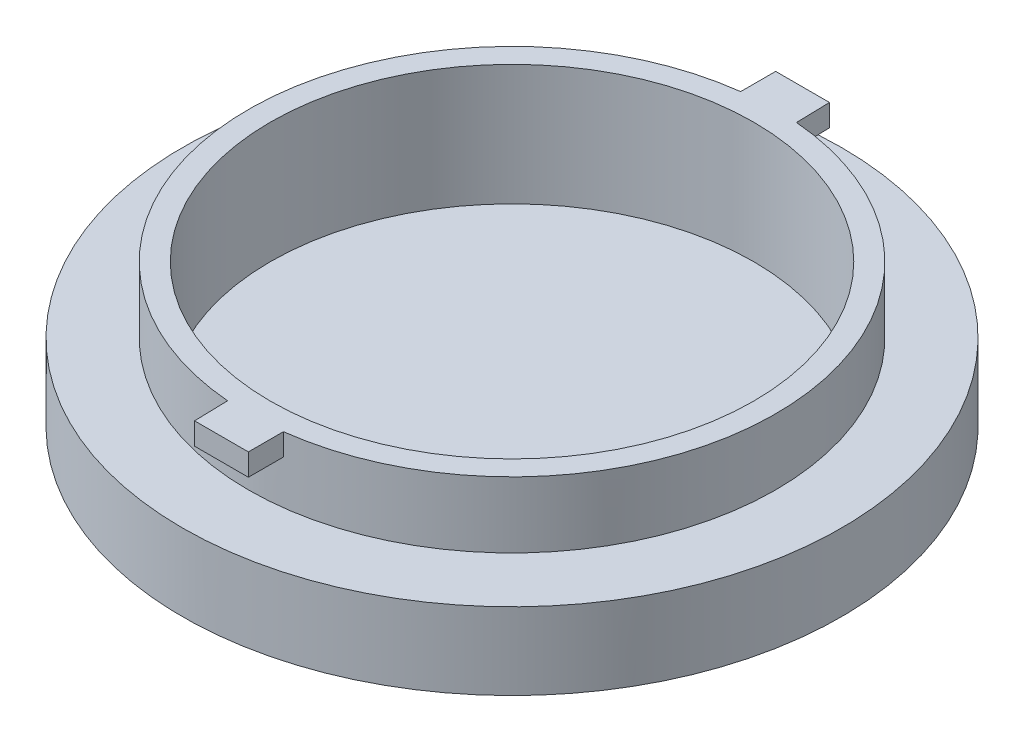
ISO-10303-21;
HEADER;
FILE_DESCRIPTION(('STEP AP214'),'2;1');
FILE_NAME('part.step','',(''),(''),'','','');
FILE_SCHEMA(('AUTOMOTIVE_DESIGN { 1 0 10303 214 1 1 1 1 }'));
ENDSEC;
DATA;
#1=APPLICATION_CONTEXT('core data for automotive mechanical design processes');
#2=APPLICATION_PROTOCOL_DEFINITION('international standard','automotive_design',2000,#1);
#3=PRODUCT_CONTEXT('',#1,'mechanical');
#4=PRODUCT('Part','Part','',(#3));
#5=PRODUCT_RELATED_PRODUCT_CATEGORY('part','',(#4));
#6=PRODUCT_DEFINITION_FORMATION('','',#4);
#7=PRODUCT_DEFINITION_CONTEXT('part definition',#1,'design');
#8=PRODUCT_DEFINITION('design','',#6,#7);
#9=PRODUCT_DEFINITION_SHAPE('','',#8);
#10=(LENGTH_UNIT() NAMED_UNIT(*) SI_UNIT(.MILLI.,.METRE.));
#11=(NAMED_UNIT(*) PLANE_ANGLE_UNIT() SI_UNIT($,.RADIAN.));
#12=(NAMED_UNIT(*) SI_UNIT($,.STERADIAN.) SOLID_ANGLE_UNIT());
#13=UNCERTAINTY_MEASURE_WITH_UNIT(LENGTH_MEASURE(1.E-05),#10,'distance_accuracy_value','');
#14=(GEOMETRIC_REPRESENTATION_CONTEXT(3) GLOBAL_UNCERTAINTY_ASSIGNED_CONTEXT((#13)) GLOBAL_UNIT_ASSIGNED_CONTEXT((#10,
#11,#12)) REPRESENTATION_CONTEXT('',''));
#15=CARTESIAN_POINT('',(0.,0.,0.));
#16=DIRECTION('',(0.,0.,1.));
#17=DIRECTION('',(1.,0.,0.));
#18=AXIS2_PLACEMENT_3D('',#15,#16,#17);
#19=CARTESIAN_POINT('',(0.,10.,0.));
#20=DIRECTION('',(0.,-1.,0.));
#21=DIRECTION('',(0.,0.,-1.));
#22=AXIS2_PLACEMENT_3D('',#19,#20,#21);
#23=CYLINDRICAL_SURFACE('',#22,30.);
#24=CARTESIAN_POINT('',(0.,10.,0.));
#25=DIRECTION('',(0.,1.,0.));
#26=DIRECTION('',(0.,0.,1.));
#27=AXIS2_PLACEMENT_3D('',#24,#25,#26);
#28=CIRCLE('',#27,30.);
#29=CARTESIAN_POINT('',(0.,10.,30.));
#30=VERTEX_POINT('',#29);
#31=EDGE_CURVE('E168',#30,#30,#28,.T.);
#32=ORIENTED_EDGE('',*,*,#31,.F.);
#33=EDGE_LOOP('',(#32));
#34=FACE_BOUND('',#33,.T.);
#35=CARTESIAN_POINT('',(0.,3.,0.));
#36=DIRECTION('',(0.,-1.,0.));
#37=DIRECTION('',(0.,0.,-1.));
#38=AXIS2_PLACEMENT_3D('',#35,#36,#37);
#39=CIRCLE('',#38,30.);
#40=CARTESIAN_POINT('',(0.,3.,-30.));
#41=VERTEX_POINT('',#40);
#42=EDGE_CURVE('E127',#41,#41,#39,.T.);
#43=ORIENTED_EDGE('',*,*,#42,.F.);
#44=EDGE_LOOP('',(#43));
#45=FACE_BOUND('',#44,.T.);
#46=ADVANCED_FACE('F34',(#34,#45),#23,.T.);
#47=CARTESIAN_POINT('',(0.,10.,0.));
#48=DIRECTION('',(0.,1.,0.));
#49=DIRECTION('',(0.,0.,1.));
#50=AXIS2_PLACEMENT_3D('',#47,#48,#49);
#51=PLANE('',#50);
#52=CARTESIAN_POINT('',(0.,10.,0.));
#53=DIRECTION('',(0.,1.,0.));
#54=DIRECTION('',(0.,0.,1.));
#55=AXIS2_PLACEMENT_3D('',#52,#53,#54);
#56=CIRCLE('',#55,24.);
#57=CARTESIAN_POINT('',(0.,10.,24.));
#58=VERTEX_POINT('',#57);
#59=EDGE_CURVE('E169',#58,#58,#56,.T.);
#60=ORIENTED_EDGE('',*,*,#59,.F.);
#61=EDGE_LOOP('',(#60));
#62=FACE_BOUND('',#61,.T.);
#63=ORIENTED_EDGE('',*,*,#31,.T.);
#64=EDGE_LOOP('',(#63));
#65=FACE_BOUND('',#64,.T.);
#66=ADVANCED_FACE('F204',(#62,#65),#51,.T.);
#67=CARTESIAN_POINT('',(0.,16.,0.));
#68=DIRECTION('',(0.,-1.,0.));
#69=DIRECTION('',(0.,0.,-1.));
#70=AXIS2_PLACEMENT_3D('',#67,#68,#69);
#71=CYLINDRICAL_SURFACE('',#70,24.);
#72=CARTESIAN_POINT('',(0.,14.,0.));
#73=DIRECTION('',(0.,1.,0.));
#74=DIRECTION('',(0.,0.,1.));
#75=AXIS2_PLACEMENT_3D('',#72,#73,#74);
#76=CIRCLE('',#75,24.);
#77=CARTESIAN_POINT('',(-1.97722416311358,14.,23.9184151776158));
#78=VERTEX_POINT('',#77);
#79=CARTESIAN_POINT('',(3.,14.,23.8117617995813));
#80=VERTEX_POINT('',#79);
#81=EDGE_CURVE('E11',#78,#80,#76,.T.);
#82=ORIENTED_EDGE('',*,*,#81,.F.);
#83=DIRECTION('',(0.,-1.,0.));
#84=VECTOR('',#83,1.);
#85=CARTESIAN_POINT('',(-1.97722416311358,16.,23.9184151776158));
#86=LINE('',#85,#84);
#87=CARTESIAN_POINT('',(-1.97722416311358,16.,23.9184151776158));
#88=VERTEX_POINT('',#87);
#89=EDGE_CURVE('E105',#78,#88,#86,.F.);
#90=ORIENTED_EDGE('',*,*,#89,.T.);
#91=CARTESIAN_POINT('',(0.,16.,0.));
#92=DIRECTION('',(0.,1.,0.));
#93=DIRECTION('',(0.,0.,1.));
#94=AXIS2_PLACEMENT_3D('',#91,#92,#93);
#95=CIRCLE('',#94,24.);
#96=CARTESIAN_POINT('',(-2.99999999999984,16.,-23.8117617995813));
#97=VERTEX_POINT('',#96);
#98=EDGE_CURVE('E166',#97,#88,#95,.T.);
#99=ORIENTED_EDGE('',*,*,#98,.F.);
#100=DIRECTION('',(0.,-1.,0.));
#101=VECTOR('',#100,1.);
#102=CARTESIAN_POINT('',(-2.99999999999984,16.,-23.8117617995813));
#103=LINE('',#102,#101);
#104=CARTESIAN_POINT('',(-2.99999999999984,14.,-23.8117617995813));
#105=VERTEX_POINT('',#104);
#106=EDGE_CURVE('E151',#97,#105,#103,.T.);
#107=ORIENTED_EDGE('',*,*,#106,.T.);
#108=CARTESIAN_POINT('',(0.,14.,0.));
#109=DIRECTION('',(0.,1.,0.));
#110=DIRECTION('',(0.,0.,1.));
#111=AXIS2_PLACEMENT_3D('',#108,#109,#110);
#112=CIRCLE('',#111,24.);
#113=CARTESIAN_POINT('',(1.97722416311375,14.,-23.9184151776157));
#114=VERTEX_POINT('',#113);
#115=EDGE_CURVE('E41',#114,#105,#112,.T.);
#116=ORIENTED_EDGE('',*,*,#115,.F.);
#117=DIRECTION('',(0.,-1.,0.));
#118=VECTOR('',#117,1.);
#119=CARTESIAN_POINT('',(1.97722416311375,16.,-23.9184151776157));
#120=LINE('',#119,#118);
#121=CARTESIAN_POINT('',(1.97722416311375,16.,-23.9184151776157));
#122=VERTEX_POINT('',#121);
#123=EDGE_CURVE('E156',#114,#122,#120,.F.);
#124=ORIENTED_EDGE('',*,*,#123,.T.);
#125=CARTESIAN_POINT('',(3.,16.,23.8117617995813));
#126=VERTEX_POINT('',#125);
#127=EDGE_CURVE('E163',#126,#122,#95,.T.);
#128=ORIENTED_EDGE('',*,*,#127,.F.);
#129=DIRECTION('',(0.,-1.,0.));
#130=VECTOR('',#129,1.);
#131=CARTESIAN_POINT('',(3.,16.,23.8117617995813));
#132=LINE('',#131,#130);
#133=EDGE_CURVE('E130',#126,#80,#132,.T.);
#134=ORIENTED_EDGE('',*,*,#133,.T.);
#135=EDGE_LOOP('',(#82,#90,#99,#107,#116,#124,#128,#134));
#136=FACE_BOUND('',#135,.T.);
#137=ORIENTED_EDGE('',*,*,#59,.T.);
#138=EDGE_LOOP('',(#137));
#139=FACE_BOUND('',#138,.T.);
#140=ADVANCED_FACE('F183',(#136,#139),#71,.T.);
#141=CARTESIAN_POINT('',(0.,16.,0.));
#142=DIRECTION('',(0.,1.,0.));
#143=DIRECTION('',(0.,0.,1.));
#144=AXIS2_PLACEMENT_3D('',#141,#142,#143);
#145=PLANE('',#144);
#146=ORIENTED_EDGE('',*,*,#98,.T.);
#147=DIRECTION('',(0.0247914420115001,0.,0.999692644967937));
#148=VECTOR('',#147,1.);
#149=CARTESIAN_POINT('',(-2.,16.,23.));
#150=LINE('',#149,#148);
#151=CARTESIAN_POINT('',(-1.9008037434854,16.,27.));
#152=VERTEX_POINT('',#151);
#153=EDGE_CURVE('E125',#88,#152,#150,.T.);
#154=ORIENTED_EDGE('',*,*,#153,.T.);
#155=DIRECTION('',(1.,0.,0.));
#156=VECTOR('',#155,1.);
#157=CARTESIAN_POINT('',(-1.9008037434854,16.,27.));
#158=LINE('',#157,#156);
#159=CARTESIAN_POINT('',(3.,16.,27.));
#160=VERTEX_POINT('',#159);
#161=EDGE_CURVE('E114',#152,#160,#158,.T.);
#162=ORIENTED_EDGE('',*,*,#161,.T.);
#163=DIRECTION('',(0.,0.,-1.));
#164=VECTOR('',#163,1.);
#165=CARTESIAN_POINT('',(3.,16.,23.));
#166=LINE('',#165,#164);
#167=EDGE_CURVE('E48',#160,#126,#166,.T.);
#168=ORIENTED_EDGE('',*,*,#167,.T.);
#169=ORIENTED_EDGE('',*,*,#127,.T.);
#170=DIRECTION('',(-0.0247914420114929,0.,-0.999692644967937));
#171=VECTOR('',#170,1.);
#172=CARTESIAN_POINT('',(2.00000000000016,16.,-23.));
#173=LINE('',#172,#171);
#174=CARTESIAN_POINT('',(1.90080374348559,16.,-27.));
#175=VERTEX_POINT('',#174);
#176=EDGE_CURVE('E135',#122,#175,#173,.T.);
#177=ORIENTED_EDGE('',*,*,#176,.T.);
#178=DIRECTION('',(-1.,0.,0.));
#179=VECTOR('',#178,1.);
#180=CARTESIAN_POINT('',(1.90080374348559,16.,-27.));
#181=LINE('',#180,#179);
#182=CARTESIAN_POINT('',(-2.99999999999981,16.,-27.0000000000001));
#183=VERTEX_POINT('',#182);
#184=EDGE_CURVE('E146',#175,#183,#181,.T.);
#185=ORIENTED_EDGE('',*,*,#184,.T.);
#186=DIRECTION('',(0.,0.,1.));
#187=VECTOR('',#186,1.);
#188=CARTESIAN_POINT('',(-2.99999999999984,16.,-23.0000000000001));
#189=LINE('',#188,#187);
#190=EDGE_CURVE('E55',#183,#97,#189,.T.);
#191=ORIENTED_EDGE('',*,*,#190,.T.);
#192=EDGE_LOOP('',(#146,#154,#162,#168,#169,#177,#185,#191));
#193=FACE_BOUND('',#192,.T.);
#194=CARTESIAN_POINT('',(0.,16.,0.));
#195=DIRECTION('',(0.,1.,0.));
#196=DIRECTION('',(0.,0.,1.));
#197=AXIS2_PLACEMENT_3D('',#194,#195,#196);
#198=CIRCLE('',#197,22.);
#199=CARTESIAN_POINT('',(0.,16.,22.));
#200=VERTEX_POINT('',#199);
#201=EDGE_CURVE('E159',#200,#200,#198,.T.);
#202=ORIENTED_EDGE('',*,*,#201,.F.);
#203=EDGE_LOOP('',(#202));
#204=FACE_BOUND('',#203,.T.);
#205=ADVANCED_FACE('F185',(#193,#204),#145,.T.);
#206=CARTESIAN_POINT('',(0.,5.,0.));
#207=DIRECTION('',(0.,1.,0.));
#208=DIRECTION('',(0.,0.,1.));
#209=AXIS2_PLACEMENT_3D('',#206,#207,#208);
#210=CYLINDRICAL_SURFACE('',#209,22.);
#211=CARTESIAN_POINT('',(0.,5.,0.));
#212=DIRECTION('',(0.,1.,0.));
#213=DIRECTION('',(0.,0.,1.));
#214=AXIS2_PLACEMENT_3D('',#211,#212,#213);
#215=CIRCLE('',#214,22.);
#216=CARTESIAN_POINT('',(0.,5.,22.));
#217=VERTEX_POINT('',#216);
#218=EDGE_CURVE('E160',#217,#217,#215,.T.);
#219=ORIENTED_EDGE('',*,*,#218,.F.);
#220=EDGE_LOOP('',(#219));
#221=FACE_BOUND('',#220,.T.);
#222=ORIENTED_EDGE('',*,*,#201,.T.);
#223=EDGE_LOOP('',(#222));
#224=FACE_BOUND('',#223,.T.);
#225=ADVANCED_FACE('F188',(#221,#224),#210,.F.);
#226=CARTESIAN_POINT('',(0.,5.,0.));
#227=DIRECTION('',(0.,1.,0.));
#228=DIRECTION('',(0.,0.,1.));
#229=AXIS2_PLACEMENT_3D('',#226,#227,#228);
#230=PLANE('',#229);
#231=ORIENTED_EDGE('',*,*,#218,.T.);
#232=EDGE_LOOP('',(#231));
#233=FACE_BOUND('',#232,.T.);
#234=ADVANCED_FACE('F193',(#233),#230,.T.);
#235=CARTESIAN_POINT('',(2.00000000000016,14.,-23.));
#236=DIRECTION('',(0.999692644967938,0.,-0.0247914420114929));
#237=DIRECTION('',(-0.0247914420114929,0.,-0.999692644967938));
#238=AXIS2_PLACEMENT_3D('',#235,#236,#237);
#239=PLANE('',#238);
#240=ORIENTED_EDGE('',*,*,#123,.F.);
#241=DIRECTION('',(-0.0247914420114929,0.,-0.999692644967937));
#242=VECTOR('',#241,1.);
#243=CARTESIAN_POINT('',(2.00000000000016,14.,-23.));
#244=LINE('',#243,#242);
#245=CARTESIAN_POINT('',(1.90080374348559,14.,-27.));
#246=VERTEX_POINT('',#245);
#247=EDGE_CURVE('E136',#114,#246,#244,.T.);
#248=ORIENTED_EDGE('',*,*,#247,.T.);
#249=DIRECTION('',(0.,1.,0.));
#250=VECTOR('',#249,1.);
#251=CARTESIAN_POINT('',(1.90080374348559,14.,-27.));
#252=LINE('',#251,#250);
#253=EDGE_CURVE('E144',#246,#175,#252,.T.);
#254=ORIENTED_EDGE('',*,*,#253,.T.);
#255=ORIENTED_EDGE('',*,*,#176,.F.);
#256=EDGE_LOOP('',(#240,#248,#254,#255));
#257=FACE_BOUND('',#256,.T.);
#258=ADVANCED_FACE('F199',(#257),#239,.T.);
#259=CARTESIAN_POINT('',(-2.99999999999984,14.,-23.0000000000001));
#260=DIRECTION('',(-1.,0.,0.));
#261=DIRECTION('',(0.,0.,1.));
#262=AXIS2_PLACEMENT_3D('',#259,#260,#261);
#263=PLANE('',#262);
#264=ORIENTED_EDGE('',*,*,#106,.F.);
#265=ORIENTED_EDGE('',*,*,#190,.F.);
#266=DIRECTION('',(0.,1.,0.));
#267=VECTOR('',#266,1.);
#268=CARTESIAN_POINT('',(-2.99999999999981,14.,-27.0000000000001));
#269=LINE('',#268,#267);
#270=CARTESIAN_POINT('',(-2.99999999999981,14.,-27.0000000000001));
#271=VERTEX_POINT('',#270);
#272=EDGE_CURVE('E149',#271,#183,#269,.T.);
#273=ORIENTED_EDGE('',*,*,#272,.F.);
#274=DIRECTION('',(0.,0.,1.));
#275=VECTOR('',#274,1.);
#276=CARTESIAN_POINT('',(-2.99999999999984,14.,-23.0000000000001));
#277=LINE('',#276,#275);
#278=EDGE_CURVE('E141',#271,#105,#277,.T.);
#279=ORIENTED_EDGE('',*,*,#278,.T.);
#280=EDGE_LOOP('',(#264,#265,#273,#279));
#281=FACE_BOUND('',#280,.T.);
#282=ADVANCED_FACE('F181',(#281),#263,.T.);
#283=CARTESIAN_POINT('',(1.90080374348559,14.,-27.));
#284=DIRECTION('',(0.,0.,-1.));
#285=DIRECTION('',(-1.,0.,0.));
#286=AXIS2_PLACEMENT_3D('',#283,#284,#285);
#287=PLANE('',#286);
#288=ORIENTED_EDGE('',*,*,#184,.F.);
#289=ORIENTED_EDGE('',*,*,#253,.F.);
#290=DIRECTION('',(-1.,0.,0.));
#291=VECTOR('',#290,1.);
#292=CARTESIAN_POINT('',(1.90080374348559,14.,-27.));
#293=LINE('',#292,#291);
#294=EDGE_CURVE('E138',#246,#271,#293,.T.);
#295=ORIENTED_EDGE('',*,*,#294,.T.);
#296=ORIENTED_EDGE('',*,*,#272,.T.);
#297=EDGE_LOOP('',(#288,#289,#295,#296));
#298=FACE_BOUND('',#297,.T.);
#299=ADVANCED_FACE('F233',(#298),#287,.T.);
#300=CARTESIAN_POINT('',(0.,14.,0.));
#301=DIRECTION('',(0.,1.,0.));
#302=DIRECTION('',(0.,0.,1.));
#303=AXIS2_PLACEMENT_3D('',#300,#301,#302);
#304=PLANE('',#303);
#305=ORIENTED_EDGE('',*,*,#247,.F.);
#306=ORIENTED_EDGE('',*,*,#115,.T.);
#307=ORIENTED_EDGE('',*,*,#278,.F.);
#308=ORIENTED_EDGE('',*,*,#294,.F.);
#309=EDGE_LOOP('',(#305,#306,#307,#308));
#310=FACE_BOUND('',#309,.T.);
#311=ADVANCED_FACE('F177',(#310),#304,.F.);
#312=CARTESIAN_POINT('',(-2.,14.,23.));
#313=DIRECTION('',(-0.999692644967937,0.,0.0247914420115001));
#314=DIRECTION('',(0.0247914420115001,0.,0.999692644967938));
#315=AXIS2_PLACEMENT_3D('',#312,#313,#314);
#316=PLANE('',#315);
#317=ORIENTED_EDGE('',*,*,#89,.F.);
#318=DIRECTION('',(0.0247914420115001,0.,0.999692644967937));
#319=VECTOR('',#318,1.);
#320=CARTESIAN_POINT('',(-2.,14.,23.));
#321=LINE('',#320,#319);
#322=CARTESIAN_POINT('',(-1.9008037434854,14.,27.));
#323=VERTEX_POINT('',#322);
#324=EDGE_CURVE('E99',#78,#323,#321,.T.);
#325=ORIENTED_EDGE('',*,*,#324,.T.);
#326=DIRECTION('',(0.,1.,0.));
#327=VECTOR('',#326,1.);
#328=CARTESIAN_POINT('',(-1.9008037434854,14.,27.));
#329=LINE('',#328,#327);
#330=EDGE_CURVE('E102',#323,#152,#329,.T.);
#331=ORIENTED_EDGE('',*,*,#330,.T.);
#332=ORIENTED_EDGE('',*,*,#153,.F.);
#333=EDGE_LOOP('',(#317,#325,#331,#332));
#334=FACE_BOUND('',#333,.T.);
#335=ADVANCED_FACE('F101',(#334),#316,.T.);
#336=CARTESIAN_POINT('',(3.,14.,23.));
#337=DIRECTION('',(1.,0.,0.));
#338=DIRECTION('',(0.,0.,-1.));
#339=AXIS2_PLACEMENT_3D('',#336,#337,#338);
#340=PLANE('',#339);
#341=ORIENTED_EDGE('',*,*,#133,.F.);
#342=ORIENTED_EDGE('',*,*,#167,.F.);
#343=DIRECTION('',(0.,1.,0.));
#344=VECTOR('',#343,1.);
#345=CARTESIAN_POINT('',(3.,14.,27.));
#346=LINE('',#345,#344);
#347=CARTESIAN_POINT('',(3.,14.,27.));
#348=VERTEX_POINT('',#347);
#349=EDGE_CURVE('E115',#348,#160,#346,.T.);
#350=ORIENTED_EDGE('',*,*,#349,.F.);
#351=DIRECTION('',(0.,0.,-1.));
#352=VECTOR('',#351,1.);
#353=CARTESIAN_POINT('',(3.,14.,23.));
#354=LINE('',#353,#352);
#355=EDGE_CURVE('E116',#348,#80,#354,.T.);
#356=ORIENTED_EDGE('',*,*,#355,.T.);
#357=EDGE_LOOP('',(#341,#342,#350,#356));
#358=FACE_BOUND('',#357,.T.);
#359=ADVANCED_FACE('F223',(#358),#340,.T.);
#360=CARTESIAN_POINT('',(-1.9008037434854,14.,27.));
#361=DIRECTION('',(0.,0.,1.));
#362=DIRECTION('',(1.,0.,0.));
#363=AXIS2_PLACEMENT_3D('',#360,#361,#362);
#364=PLANE('',#363);
#365=ORIENTED_EDGE('',*,*,#161,.F.);
#366=ORIENTED_EDGE('',*,*,#330,.F.);
#367=DIRECTION('',(1.,0.,0.));
#368=VECTOR('',#367,1.);
#369=CARTESIAN_POINT('',(-1.9008037434854,14.,27.));
#370=LINE('',#369,#368);
#371=EDGE_CURVE('E109',#323,#348,#370,.T.);
#372=ORIENTED_EDGE('',*,*,#371,.T.);
#373=ORIENTED_EDGE('',*,*,#349,.T.);
#374=EDGE_LOOP('',(#365,#366,#372,#373));
#375=FACE_BOUND('',#374,.T.);
#376=ADVANCED_FACE('F113',(#375),#364,.T.);
#377=CARTESIAN_POINT('',(0.,14.,0.));
#378=DIRECTION('',(0.,1.,0.));
#379=DIRECTION('',(0.,0.,1.));
#380=AXIS2_PLACEMENT_3D('',#377,#378,#379);
#381=PLANE('',#380);
#382=ORIENTED_EDGE('',*,*,#324,.F.);
#383=ORIENTED_EDGE('',*,*,#81,.T.);
#384=ORIENTED_EDGE('',*,*,#355,.F.);
#385=ORIENTED_EDGE('',*,*,#371,.F.);
#386=EDGE_LOOP('',(#382,#383,#384,#385));
#387=FACE_BOUND('',#386,.T.);
#388=ADVANCED_FACE('F119',(#387),#381,.F.);
#389=CARTESIAN_POINT('',(0.,3.,0.));
#390=DIRECTION('',(0.,-1.,0.));
#391=DIRECTION('',(0.,0.,-1.));
#392=AXIS2_PLACEMENT_3D('',#389,#390,#391);
#393=PLANE('',#392);
#394=ORIENTED_EDGE('',*,*,#42,.T.);
#395=EDGE_LOOP('',(#394));
#396=FACE_BOUND('',#395,.T.);
#397=ADVANCED_FACE('F215',(#396),#393,.T.);
#398=CLOSED_SHELL('',(#46,#66,#140,#205,#225,#234,#258,#282,#299,#311,#335,#359,#376,#388,#397));
#399=MANIFOLD_SOLID_BREP('B2',#398);
#400=ADVANCED_BREP_SHAPE_REPRESENTATION('',(#18,#399),#14);
#401=SHAPE_DEFINITION_REPRESENTATION(#9,#400);
ENDSEC;
END-ISO-10303-21;
